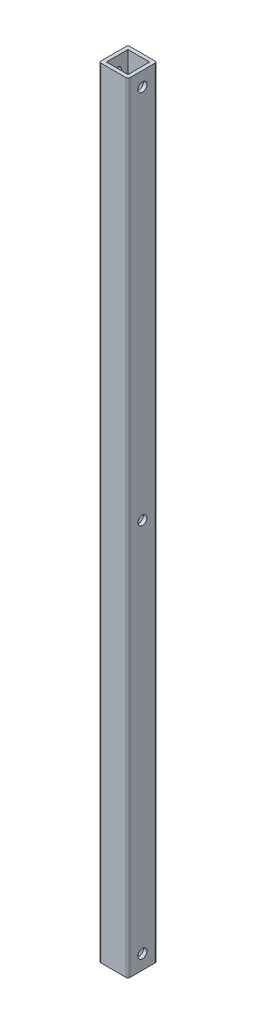
ISO-10303-21;
HEADER;
FILE_DESCRIPTION(('STEP AP214'),'2;1');
FILE_NAME('part.step','',(''),(''),'','','');
FILE_SCHEMA(('AUTOMOTIVE_DESIGN { 1 0 10303 214 1 1 1 1 }'));
ENDSEC;
DATA;
#1=APPLICATION_CONTEXT('core data for automotive mechanical design processes');
#2=APPLICATION_PROTOCOL_DEFINITION('international standard','automotive_design',2000,#1);
#3=PRODUCT_CONTEXT('',#1,'mechanical');
#4=PRODUCT('Part','Part','',(#3));
#5=PRODUCT_RELATED_PRODUCT_CATEGORY('part','',(#4));
#6=PRODUCT_DEFINITION_FORMATION('','',#4);
#7=PRODUCT_DEFINITION_CONTEXT('part definition',#1,'design');
#8=PRODUCT_DEFINITION('design','',#6,#7);
#9=PRODUCT_DEFINITION_SHAPE('','',#8);
#10=(LENGTH_UNIT() NAMED_UNIT(*) SI_UNIT(.MILLI.,.METRE.));
#11=(NAMED_UNIT(*) PLANE_ANGLE_UNIT() SI_UNIT($,.RADIAN.));
#12=(NAMED_UNIT(*) SI_UNIT($,.STERADIAN.) SOLID_ANGLE_UNIT());
#13=UNCERTAINTY_MEASURE_WITH_UNIT(LENGTH_MEASURE(1.E-05),#10,'distance_accuracy_value','');
#14=(GEOMETRIC_REPRESENTATION_CONTEXT(3) GLOBAL_UNCERTAINTY_ASSIGNED_CONTEXT((#13)) GLOBAL_UNIT_ASSIGNED_CONTEXT((#10,
#11,#12)) REPRESENTATION_CONTEXT('',''));
#15=CARTESIAN_POINT('',(0.,0.,0.));
#16=DIRECTION('',(0.,0.,1.));
#17=DIRECTION('',(1.,0.,0.));
#18=AXIS2_PLACEMENT_3D('',#15,#16,#17);
#19=CARTESIAN_POINT('',(0.,432.,0.));
#20=DIRECTION('',(0.,1.,0.));
#21=DIRECTION('',(0.,0.,1.));
#22=AXIS2_PLACEMENT_3D('',#19,#20,#21);
#23=PLANE('',#22);
#24=DIRECTION('',(-1.,0.,0.));
#25=VECTOR('',#24,1.);
#26=CARTESIAN_POINT('',(-5.51612903225806,432.,-5.7741935483871));
#27=LINE('',#26,#25);
#28=CARTESIAN_POINT('',(9.48387096774194,432.,-5.7741935483871));
#29=VERTEX_POINT('',#28);
#30=CARTESIAN_POINT('',(-4.51612903225806,432.,-5.7741935483871));
#31=VERTEX_POINT('',#30);
#32=EDGE_CURVE('E208',#29,#31,#27,.T.);
#33=ORIENTED_EDGE('',*,*,#32,.T.);
#34=CARTESIAN_POINT('',(-4.51612903225806,432.,-4.7741935483871));
#35=DIRECTION('',(0.,1.,0.));
#36=DIRECTION('',(0.,0.,1.));
#37=AXIS2_PLACEMENT_3D('',#34,#35,#36);
#38=CIRCLE('',#37,1.);
#39=CARTESIAN_POINT('',(-5.51612903225806,432.,-4.7741935483871));
#40=VERTEX_POINT('',#39);
#41=EDGE_CURVE('E259',#31,#40,#38,.T.);
#42=ORIENTED_EDGE('',*,*,#41,.T.);
#43=DIRECTION('',(0.,0.,1.));
#44=VECTOR('',#43,1.);
#45=CARTESIAN_POINT('',(-5.51612903225806,432.,-5.7741935483871));
#46=LINE('',#45,#44);
#47=CARTESIAN_POINT('',(-5.51612903225806,432.,9.2258064516129));
#48=VERTEX_POINT('',#47);
#49=EDGE_CURVE('E197',#40,#48,#46,.T.);
#50=ORIENTED_EDGE('',*,*,#49,.T.);
#51=CARTESIAN_POINT('',(-4.51612903225806,432.,9.2258064516129));
#52=DIRECTION('',(0.,1.,0.));
#53=DIRECTION('',(0.,0.,1.));
#54=AXIS2_PLACEMENT_3D('',#51,#52,#53);
#55=CIRCLE('',#54,1.);
#56=CARTESIAN_POINT('',(-4.51612903225806,432.,10.2258064516129));
#57=VERTEX_POINT('',#56);
#58=EDGE_CURVE('E256',#48,#57,#55,.T.);
#59=ORIENTED_EDGE('',*,*,#58,.T.);
#60=DIRECTION('',(1.,0.,0.));
#61=VECTOR('',#60,1.);
#62=CARTESIAN_POINT('',(-5.51612903225806,432.,10.2258064516129));
#63=LINE('',#62,#61);
#64=CARTESIAN_POINT('',(9.48387096774194,432.,10.2258064516129));
#65=VERTEX_POINT('',#64);
#66=EDGE_CURVE('E201',#57,#65,#63,.T.);
#67=ORIENTED_EDGE('',*,*,#66,.T.);
#68=CARTESIAN_POINT('',(9.48387096774194,432.,9.2258064516129));
#69=DIRECTION('',(0.,1.,0.));
#70=DIRECTION('',(0.,0.,1.));
#71=AXIS2_PLACEMENT_3D('',#68,#69,#70);
#72=CIRCLE('',#71,1.);
#73=CARTESIAN_POINT('',(10.4838709677419,432.,9.2258064516129));
#74=VERTEX_POINT('',#73);
#75=EDGE_CURVE('E72',#65,#74,#72,.T.);
#76=ORIENTED_EDGE('',*,*,#75,.T.);
#77=DIRECTION('',(0.,0.,-1.));
#78=VECTOR('',#77,1.);
#79=CARTESIAN_POINT('',(10.4838709677419,432.,-5.7741935483871));
#80=LINE('',#79,#78);
#81=CARTESIAN_POINT('',(10.4838709677419,432.,-4.7741935483871));
#82=VERTEX_POINT('',#81);
#83=EDGE_CURVE('E205',#74,#82,#80,.T.);
#84=ORIENTED_EDGE('',*,*,#83,.T.);
#85=CARTESIAN_POINT('',(9.48387096774194,432.,-4.7741935483871));
#86=DIRECTION('',(0.,1.,0.));
#87=DIRECTION('',(0.,0.,1.));
#88=AXIS2_PLACEMENT_3D('',#85,#86,#87);
#89=CIRCLE('',#88,1.);
#90=EDGE_CURVE('E253',#82,#29,#89,.T.);
#91=ORIENTED_EDGE('',*,*,#90,.T.);
#92=EDGE_LOOP('',(#33,#42,#50,#59,#67,#76,#84,#91));
#93=FACE_BOUND('',#92,.T.);
#94=DIRECTION('',(0.,0.,1.));
#95=VECTOR('',#94,1.);
#96=CARTESIAN_POINT('',(-3.51612903225806,432.,-3.7741935483871));
#97=LINE('',#96,#95);
#98=CARTESIAN_POINT('',(-3.51612903225806,432.,-3.7741935483871));
#99=VERTEX_POINT('',#98);
#100=CARTESIAN_POINT('',(-3.51612903225806,432.,8.2258064516129));
#101=VERTEX_POINT('',#100);
#102=EDGE_CURVE('E153',#99,#101,#97,.T.);
#103=ORIENTED_EDGE('',*,*,#102,.F.);
#104=DIRECTION('',(-1.,0.,0.));
#105=VECTOR('',#104,1.);
#106=CARTESIAN_POINT('',(-3.51612903225806,432.,-3.7741935483871));
#107=LINE('',#106,#105);
#108=CARTESIAN_POINT('',(8.48387096774194,432.,-3.7741935483871));
#109=VERTEX_POINT('',#108);
#110=EDGE_CURVE('E142',#109,#99,#107,.T.);
#111=ORIENTED_EDGE('',*,*,#110,.F.);
#112=DIRECTION('',(0.,0.,-1.));
#113=VECTOR('',#112,1.);
#114=CARTESIAN_POINT('',(8.48387096774194,432.,-3.7741935483871));
#115=LINE('',#114,#113);
#116=CARTESIAN_POINT('',(8.48387096774194,432.,8.2258064516129));
#117=VERTEX_POINT('',#116);
#118=EDGE_CURVE('E171',#117,#109,#115,.T.);
#119=ORIENTED_EDGE('',*,*,#118,.F.);
#120=DIRECTION('',(1.,0.,0.));
#121=VECTOR('',#120,1.);
#122=CARTESIAN_POINT('',(-3.51612903225806,432.,8.2258064516129));
#123=LINE('',#122,#121);
#124=EDGE_CURVE('E167',#101,#117,#123,.T.);
#125=ORIENTED_EDGE('',*,*,#124,.F.);
#126=EDGE_LOOP('',(#103,#111,#119,#125));
#127=FACE_BOUND('',#126,.T.);
#128=ADVANCED_FACE('F49',(#93,#127),#23,.T.);
#129=CARTESIAN_POINT('',(0.,0.,0.));
#130=DIRECTION('',(0.,1.,0.));
#131=DIRECTION('',(0.,0.,1.));
#132=AXIS2_PLACEMENT_3D('',#129,#130,#131);
#133=PLANE('',#132);
#134=DIRECTION('',(0.,0.,1.));
#135=VECTOR('',#134,1.);
#136=CARTESIAN_POINT('',(-5.51612903225806,0.,-5.7741935483871));
#137=LINE('',#136,#135);
#138=CARTESIAN_POINT('',(-5.51612903225806,0.,-4.7741935483871));
#139=VERTEX_POINT('',#138);
#140=CARTESIAN_POINT('',(-5.51612903225806,0.,9.2258064516129));
#141=VERTEX_POINT('',#140);
#142=EDGE_CURVE('E162',#139,#141,#137,.T.);
#143=ORIENTED_EDGE('',*,*,#142,.F.);
#144=CARTESIAN_POINT('',(-4.51612903225806,0.,-4.7741935483871));
#145=DIRECTION('',(0.,1.,0.));
#146=DIRECTION('',(0.,0.,1.));
#147=AXIS2_PLACEMENT_3D('',#144,#145,#146);
#148=CIRCLE('',#147,1.);
#149=CARTESIAN_POINT('',(-4.51612903225806,0.,-5.7741935483871));
#150=VERTEX_POINT('',#149);
#151=EDGE_CURVE('E241',#139,#150,#148,.F.);
#152=ORIENTED_EDGE('',*,*,#151,.T.);
#153=DIRECTION('',(-1.,0.,0.));
#154=VECTOR('',#153,1.);
#155=CARTESIAN_POINT('',(-5.51612903225806,0.,-5.7741935483871));
#156=LINE('',#155,#154);
#157=CARTESIAN_POINT('',(9.48387096774194,0.,-5.7741935483871));
#158=VERTEX_POINT('',#157);
#159=EDGE_CURVE('E202',#158,#150,#156,.T.);
#160=ORIENTED_EDGE('',*,*,#159,.F.);
#161=CARTESIAN_POINT('',(9.48387096774194,0.,-4.7741935483871));
#162=DIRECTION('',(0.,1.,0.));
#163=DIRECTION('',(0.,0.,1.));
#164=AXIS2_PLACEMENT_3D('',#161,#162,#163);
#165=CIRCLE('',#164,1.);
#166=CARTESIAN_POINT('',(10.4838709677419,0.,-4.7741935483871));
#167=VERTEX_POINT('',#166);
#168=EDGE_CURVE('E235',#158,#167,#165,.F.);
#169=ORIENTED_EDGE('',*,*,#168,.T.);
#170=DIRECTION('',(0.,0.,-1.));
#171=VECTOR('',#170,1.);
#172=CARTESIAN_POINT('',(10.4838709677419,0.,-5.7741935483871));
#173=LINE('',#172,#171);
#174=CARTESIAN_POINT('',(10.4838709677419,0.,9.2258064516129));
#175=VERTEX_POINT('',#174);
#176=EDGE_CURVE('E220',#175,#167,#173,.T.);
#177=ORIENTED_EDGE('',*,*,#176,.F.);
#178=CARTESIAN_POINT('',(9.48387096774194,0.,9.2258064516129));
#179=DIRECTION('',(0.,1.,0.));
#180=DIRECTION('',(0.,0.,1.));
#181=AXIS2_PLACEMENT_3D('',#178,#179,#180);
#182=CIRCLE('',#181,1.);
#183=CARTESIAN_POINT('',(9.48387096774194,0.,10.2258064516129));
#184=VERTEX_POINT('',#183);
#185=EDGE_CURVE('E232',#175,#184,#182,.F.);
#186=ORIENTED_EDGE('',*,*,#185,.T.);
#187=DIRECTION('',(1.,0.,0.));
#188=VECTOR('',#187,1.);
#189=CARTESIAN_POINT('',(-5.51612903225806,0.,10.2258064516129));
#190=LINE('',#189,#188);
#191=CARTESIAN_POINT('',(-4.51612903225806,0.,10.2258064516129));
#192=VERTEX_POINT('',#191);
#193=EDGE_CURVE('E216',#192,#184,#190,.T.);
#194=ORIENTED_EDGE('',*,*,#193,.F.);
#195=CARTESIAN_POINT('',(-4.51612903225806,0.,9.2258064516129));
#196=DIRECTION('',(0.,1.,0.));
#197=DIRECTION('',(0.,0.,1.));
#198=AXIS2_PLACEMENT_3D('',#195,#196,#197);
#199=CIRCLE('',#198,1.);
#200=EDGE_CURVE('E238',#192,#141,#199,.F.);
#201=ORIENTED_EDGE('',*,*,#200,.T.);
#202=EDGE_LOOP('',(#143,#152,#160,#169,#177,#186,#194,#201));
#203=FACE_BOUND('',#202,.T.);
#204=DIRECTION('',(-1.,0.,0.));
#205=VECTOR('',#204,1.);
#206=CARTESIAN_POINT('',(-3.51612903225806,0.,-3.7741935483871));
#207=LINE('',#206,#205);
#208=CARTESIAN_POINT('',(8.48387096774194,0.,-3.7741935483871));
#209=VERTEX_POINT('',#208);
#210=CARTESIAN_POINT('',(-3.51612903225806,0.,-3.7741935483871));
#211=VERTEX_POINT('',#210);
#212=EDGE_CURVE('E177',#209,#211,#207,.T.);
#213=ORIENTED_EDGE('',*,*,#212,.T.);
#214=DIRECTION('',(0.,0.,1.));
#215=VECTOR('',#214,1.);
#216=CARTESIAN_POINT('',(-3.51612903225806,0.,-3.7741935483871));
#217=LINE('',#216,#215);
#218=CARTESIAN_POINT('',(-3.51612903225806,0.,8.2258064516129));
#219=VERTEX_POINT('',#218);
#220=EDGE_CURVE('E160',#211,#219,#217,.T.);
#221=ORIENTED_EDGE('',*,*,#220,.T.);
#222=DIRECTION('',(1.,0.,0.));
#223=VECTOR('',#222,1.);
#224=CARTESIAN_POINT('',(-3.51612903225806,0.,8.2258064516129));
#225=LINE('',#224,#223);
#226=CARTESIAN_POINT('',(8.48387096774194,0.,8.2258064516129));
#227=VERTEX_POINT('',#226);
#228=EDGE_CURVE('E183',#219,#227,#225,.T.);
#229=ORIENTED_EDGE('',*,*,#228,.T.);
#230=DIRECTION('',(0.,0.,-1.));
#231=VECTOR('',#230,1.);
#232=CARTESIAN_POINT('',(8.48387096774194,0.,-3.7741935483871));
#233=LINE('',#232,#231);
#234=EDGE_CURVE('E154',#227,#209,#233,.T.);
#235=ORIENTED_EDGE('',*,*,#234,.T.);
#236=EDGE_LOOP('',(#213,#221,#229,#235));
#237=FACE_BOUND('',#236,.T.);
#238=ADVANCED_FACE('F337',(#203,#237),#133,.F.);
#239=CARTESIAN_POINT('',(-5.51612903225806,432.,-5.7741935483871));
#240=DIRECTION('',(1.,0.,0.));
#241=DIRECTION('',(0.,0.,-1.));
#242=AXIS2_PLACEMENT_3D('',#239,#240,#241);
#243=PLANE('',#242);
#244=CARTESIAN_POINT('',(-5.51612903225806,216.,2.2258064516129));
#245=DIRECTION('',(-1.,0.,0.));
#246=DIRECTION('',(0.,0.,1.));
#247=AXIS2_PLACEMENT_3D('',#244,#245,#246);
#248=CIRCLE('',#247,2.5);
#249=CARTESIAN_POINT('',(-5.51612903225806,216.,4.7258064516129));
#250=VERTEX_POINT('',#249);
#251=EDGE_CURVE('E309',#250,#250,#248,.T.);
#252=ORIENTED_EDGE('',*,*,#251,.F.);
#253=EDGE_LOOP('',(#252));
#254=FACE_BOUND('',#253,.T.);
#255=CARTESIAN_POINT('',(-5.51612903225806,424.,2.2258064516129));
#256=DIRECTION('',(-1.,0.,0.));
#257=DIRECTION('',(0.,0.,1.));
#258=AXIS2_PLACEMENT_3D('',#255,#256,#257);
#259=CIRCLE('',#258,2.5);
#260=CARTESIAN_POINT('',(-5.51612903225806,424.,4.7258064516129));
#261=VERTEX_POINT('',#260);
#262=EDGE_CURVE('E299',#261,#261,#259,.T.);
#263=ORIENTED_EDGE('',*,*,#262,.F.);
#264=EDGE_LOOP('',(#263));
#265=FACE_BOUND('',#264,.T.);
#266=CARTESIAN_POINT('',(-5.51612903225806,8.,2.2258064516129));
#267=DIRECTION('',(-1.,0.,0.));
#268=DIRECTION('',(0.,0.,1.));
#269=AXIS2_PLACEMENT_3D('',#266,#267,#268);
#270=CIRCLE('',#269,2.5);
#271=CARTESIAN_POINT('',(-5.51612903225806,8.,4.7258064516129));
#272=VERTEX_POINT('',#271);
#273=EDGE_CURVE('E294',#272,#272,#270,.T.);
#274=ORIENTED_EDGE('',*,*,#273,.F.);
#275=EDGE_LOOP('',(#274));
#276=FACE_BOUND('',#275,.T.);
#277=ORIENTED_EDGE('',*,*,#49,.F.);
#278=DIRECTION('',(0.,-1.,0.));
#279=VECTOR('',#278,1.);
#280=CARTESIAN_POINT('',(-5.51612903225806,432.,-4.7741935483871));
#281=LINE('',#280,#279);
#282=EDGE_CURVE('E228',#40,#139,#281,.T.);
#283=ORIENTED_EDGE('',*,*,#282,.T.);
#284=ORIENTED_EDGE('',*,*,#142,.T.);
#285=DIRECTION('',(0.,-1.,0.));
#286=VECTOR('',#285,1.);
#287=CARTESIAN_POINT('',(-5.51612903225806,432.,9.2258064516129));
#288=LINE('',#287,#286);
#289=EDGE_CURVE('E212',#141,#48,#288,.F.);
#290=ORIENTED_EDGE('',*,*,#289,.T.);
#291=EDGE_LOOP('',(#277,#283,#284,#290));
#292=FACE_BOUND('',#291,.T.);
#293=ADVANCED_FACE('F351',(#254,#265,#276,#292),#243,.F.);
#294=CARTESIAN_POINT('',(-5.51612903225806,432.,10.2258064516129));
#295=DIRECTION('',(0.,0.,-1.));
#296=DIRECTION('',(-1.,0.,0.));
#297=AXIS2_PLACEMENT_3D('',#294,#295,#296);
#298=PLANE('',#297);
#299=ORIENTED_EDGE('',*,*,#66,.F.);
#300=DIRECTION('',(0.,-1.,0.));
#301=VECTOR('',#300,1.);
#302=CARTESIAN_POINT('',(-4.51612903225806,432.,10.2258064516129));
#303=LINE('',#302,#301);
#304=EDGE_CURVE('E265',#57,#192,#303,.T.);
#305=ORIENTED_EDGE('',*,*,#304,.T.);
#306=ORIENTED_EDGE('',*,*,#193,.T.);
#307=DIRECTION('',(0.,-1.,0.));
#308=VECTOR('',#307,1.);
#309=CARTESIAN_POINT('',(9.48387096774194,432.,10.2258064516129));
#310=LINE('',#309,#308);
#311=EDGE_CURVE('E262',#184,#65,#310,.F.);
#312=ORIENTED_EDGE('',*,*,#311,.T.);
#313=EDGE_LOOP('',(#299,#305,#306,#312));
#314=FACE_BOUND('',#313,.T.);
#315=ADVANCED_FACE('F363',(#314),#298,.F.);
#316=CARTESIAN_POINT('',(10.4838709677419,432.,-5.7741935483871));
#317=DIRECTION('',(-1.,0.,0.));
#318=DIRECTION('',(0.,0.,1.));
#319=AXIS2_PLACEMENT_3D('',#316,#317,#318);
#320=PLANE('',#319);
#321=CARTESIAN_POINT('',(10.4838709677419,216.,2.2258064516129));
#322=DIRECTION('',(-1.,0.,0.));
#323=DIRECTION('',(0.,0.,1.));
#324=AXIS2_PLACEMENT_3D('',#321,#322,#323);
#325=CIRCLE('',#324,2.5);
#326=CARTESIAN_POINT('',(10.4838709677419,216.,4.7258064516129));
#327=VERTEX_POINT('',#326);
#328=EDGE_CURVE('E313',#327,#327,#325,.T.);
#329=ORIENTED_EDGE('',*,*,#328,.T.);
#330=EDGE_LOOP('',(#329));
#331=FACE_BOUND('',#330,.T.);
#332=CARTESIAN_POINT('',(10.4838709677419,424.,2.2258064516129));
#333=DIRECTION('',(-1.,0.,0.));
#334=DIRECTION('',(0.,0.,1.));
#335=AXIS2_PLACEMENT_3D('',#332,#333,#334);
#336=CIRCLE('',#335,2.5);
#337=CARTESIAN_POINT('',(10.4838709677419,424.,4.7258064516129));
#338=VERTEX_POINT('',#337);
#339=EDGE_CURVE('E276',#338,#338,#336,.T.);
#340=ORIENTED_EDGE('',*,*,#339,.T.);
#341=EDGE_LOOP('',(#340));
#342=FACE_BOUND('',#341,.T.);
#343=CARTESIAN_POINT('',(10.4838709677419,8.,2.2258064516129));
#344=DIRECTION('',(-1.,0.,0.));
#345=DIRECTION('',(0.,0.,1.));
#346=AXIS2_PLACEMENT_3D('',#343,#344,#345);
#347=CIRCLE('',#346,2.5);
#348=CARTESIAN_POINT('',(10.4838709677419,8.,4.7258064516129));
#349=VERTEX_POINT('',#348);
#350=EDGE_CURVE('E290',#349,#349,#347,.T.);
#351=ORIENTED_EDGE('',*,*,#350,.T.);
#352=EDGE_LOOP('',(#351));
#353=FACE_BOUND('',#352,.T.);
#354=ORIENTED_EDGE('',*,*,#176,.T.);
#355=DIRECTION('',(0.,-1.,0.));
#356=VECTOR('',#355,1.);
#357=CARTESIAN_POINT('',(10.4838709677419,432.,-4.7741935483871));
#358=LINE('',#357,#356);
#359=EDGE_CURVE('E11',#167,#82,#358,.F.);
#360=ORIENTED_EDGE('',*,*,#359,.T.);
#361=ORIENTED_EDGE('',*,*,#83,.F.);
#362=DIRECTION('',(0.,-1.,0.));
#363=VECTOR('',#362,1.);
#364=CARTESIAN_POINT('',(10.4838709677419,432.,9.2258064516129));
#365=LINE('',#364,#363);
#366=EDGE_CURVE('E59',#74,#175,#365,.T.);
#367=ORIENTED_EDGE('',*,*,#366,.T.);
#368=EDGE_LOOP('',(#354,#360,#361,#367));
#369=FACE_BOUND('',#368,.T.);
#370=ADVANCED_FACE('F359',(#331,#342,#353,#369),#320,.F.);
#371=CARTESIAN_POINT('',(-5.51612903225806,432.,-5.7741935483871));
#372=DIRECTION('',(0.,0.,1.));
#373=DIRECTION('',(1.,0.,0.));
#374=AXIS2_PLACEMENT_3D('',#371,#372,#373);
#375=PLANE('',#374);
#376=ORIENTED_EDGE('',*,*,#159,.T.);
#377=DIRECTION('',(0.,-1.,0.));
#378=VECTOR('',#377,1.);
#379=CARTESIAN_POINT('',(-4.51612903225806,432.,-5.7741935483871));
#380=LINE('',#379,#378);
#381=EDGE_CURVE('E248',#150,#31,#380,.F.);
#382=ORIENTED_EDGE('',*,*,#381,.T.);
#383=ORIENTED_EDGE('',*,*,#32,.F.);
#384=DIRECTION('',(0.,-1.,0.));
#385=VECTOR('',#384,1.);
#386=CARTESIAN_POINT('',(9.48387096774194,432.,-5.7741935483871));
#387=LINE('',#386,#385);
#388=EDGE_CURVE('E244',#29,#158,#387,.T.);
#389=ORIENTED_EDGE('',*,*,#388,.T.);
#390=EDGE_LOOP('',(#376,#382,#383,#389));
#391=FACE_BOUND('',#390,.T.);
#392=ADVANCED_FACE('F356',(#391),#375,.F.);
#393=CARTESIAN_POINT('',(-3.51612903225806,432.,-3.7741935483871));
#394=DIRECTION('',(0.,0.,1.));
#395=DIRECTION('',(1.,0.,0.));
#396=AXIS2_PLACEMENT_3D('',#393,#394,#395);
#397=PLANE('',#396);
#398=ORIENTED_EDGE('',*,*,#212,.F.);
#399=DIRECTION('',(0.,-1.,0.));
#400=VECTOR('',#399,1.);
#401=CARTESIAN_POINT('',(8.48387096774194,432.,-3.7741935483871));
#402=LINE('',#401,#400);
#403=EDGE_CURVE('E148',#109,#209,#402,.T.);
#404=ORIENTED_EDGE('',*,*,#403,.F.);
#405=ORIENTED_EDGE('',*,*,#110,.T.);
#406=DIRECTION('',(0.,-1.,0.));
#407=VECTOR('',#406,1.);
#408=CARTESIAN_POINT('',(-3.51612903225806,432.,-3.7741935483871));
#409=LINE('',#408,#407);
#410=EDGE_CURVE('E145',#99,#211,#409,.T.);
#411=ORIENTED_EDGE('',*,*,#410,.T.);
#412=EDGE_LOOP('',(#398,#404,#405,#411));
#413=FACE_BOUND('',#412,.T.);
#414=ADVANCED_FACE('F144',(#413),#397,.T.);
#415=CARTESIAN_POINT('',(-3.51612903225806,432.,-3.7741935483871));
#416=DIRECTION('',(1.,0.,0.));
#417=DIRECTION('',(0.,0.,-1.));
#418=AXIS2_PLACEMENT_3D('',#415,#416,#417);
#419=PLANE('',#418);
#420=CARTESIAN_POINT('',(-3.51612903225806,216.,2.2258064516129));
#421=DIRECTION('',(1.,0.,0.));
#422=DIRECTION('',(0.,0.,-1.));
#423=AXIS2_PLACEMENT_3D('',#420,#421,#422);
#424=CIRCLE('',#423,2.5);
#425=CARTESIAN_POINT('',(-3.51612903225806,216.,-0.2741935483871));
#426=VERTEX_POINT('',#425);
#427=EDGE_CURVE('E295',#426,#426,#424,.T.);
#428=ORIENTED_EDGE('',*,*,#427,.F.);
#429=EDGE_LOOP('',(#428));
#430=FACE_BOUND('',#429,.T.);
#431=CARTESIAN_POINT('',(-3.51612903225806,424.,2.2258064516129));
#432=DIRECTION('',(1.,0.,0.));
#433=DIRECTION('',(0.,0.,-1.));
#434=AXIS2_PLACEMENT_3D('',#431,#432,#433);
#435=CIRCLE('',#434,2.5);
#436=CARTESIAN_POINT('',(-3.51612903225806,424.,-0.274193548387098));
#437=VERTEX_POINT('',#436);
#438=EDGE_CURVE('E180',#437,#437,#435,.T.);
#439=ORIENTED_EDGE('',*,*,#438,.F.);
#440=EDGE_LOOP('',(#439));
#441=FACE_BOUND('',#440,.T.);
#442=CARTESIAN_POINT('',(-3.51612903225806,8.,2.2258064516129));
#443=DIRECTION('',(1.,0.,0.));
#444=DIRECTION('',(0.,0.,-1.));
#445=AXIS2_PLACEMENT_3D('',#442,#443,#444);
#446=CIRCLE('',#445,2.5);
#447=CARTESIAN_POINT('',(-3.51612903225806,8.,-0.2741935483871));
#448=VERTEX_POINT('',#447);
#449=EDGE_CURVE('E275',#448,#448,#446,.T.);
#450=ORIENTED_EDGE('',*,*,#449,.F.);
#451=EDGE_LOOP('',(#450));
#452=FACE_BOUND('',#451,.T.);
#453=ORIENTED_EDGE('',*,*,#220,.F.);
#454=ORIENTED_EDGE('',*,*,#410,.F.);
#455=ORIENTED_EDGE('',*,*,#102,.T.);
#456=DIRECTION('',(0.,-1.,0.));
#457=VECTOR('',#456,1.);
#458=CARTESIAN_POINT('',(-3.51612903225806,432.,8.2258064516129));
#459=LINE('',#458,#457);
#460=EDGE_CURVE('E163',#101,#219,#459,.T.);
#461=ORIENTED_EDGE('',*,*,#460,.T.);
#462=EDGE_LOOP('',(#453,#454,#455,#461));
#463=FACE_BOUND('',#462,.T.);
#464=ADVANCED_FACE('F157',(#430,#441,#452,#463),#419,.T.);
#465=CARTESIAN_POINT('',(-3.51612903225806,432.,8.2258064516129));
#466=DIRECTION('',(0.,0.,-1.));
#467=DIRECTION('',(-1.,0.,0.));
#468=AXIS2_PLACEMENT_3D('',#465,#466,#467);
#469=PLANE('',#468);
#470=ORIENTED_EDGE('',*,*,#228,.F.);
#471=ORIENTED_EDGE('',*,*,#460,.F.);
#472=ORIENTED_EDGE('',*,*,#124,.T.);
#473=DIRECTION('',(0.,-1.,0.));
#474=VECTOR('',#473,1.);
#475=CARTESIAN_POINT('',(8.48387096774194,432.,8.2258064516129));
#476=LINE('',#475,#474);
#477=EDGE_CURVE('E192',#117,#227,#476,.T.);
#478=ORIENTED_EDGE('',*,*,#477,.T.);
#479=EDGE_LOOP('',(#470,#471,#472,#478));
#480=FACE_BOUND('',#479,.T.);
#481=ADVANCED_FACE('F329',(#480),#469,.T.);
#482=CARTESIAN_POINT('',(8.48387096774194,432.,-3.7741935483871));
#483=DIRECTION('',(-1.,0.,0.));
#484=DIRECTION('',(0.,0.,1.));
#485=AXIS2_PLACEMENT_3D('',#482,#483,#484);
#486=PLANE('',#485);
#487=CARTESIAN_POINT('',(8.48387096774194,216.,2.2258064516129));
#488=DIRECTION('',(-1.,0.,0.));
#489=DIRECTION('',(0.,0.,1.));
#490=AXIS2_PLACEMENT_3D('',#487,#488,#489);
#491=CIRCLE('',#490,2.5);
#492=CARTESIAN_POINT('',(8.48387096774194,216.,4.7258064516129));
#493=VERTEX_POINT('',#492);
#494=EDGE_CURVE('E53',#493,#493,#491,.T.);
#495=ORIENTED_EDGE('',*,*,#494,.F.);
#496=EDGE_LOOP('',(#495));
#497=FACE_BOUND('',#496,.T.);
#498=CARTESIAN_POINT('',(8.48387096774194,424.,2.2258064516129));
#499=DIRECTION('',(-1.,0.,0.));
#500=DIRECTION('',(0.,0.,1.));
#501=AXIS2_PLACEMENT_3D('',#498,#499,#500);
#502=CIRCLE('',#501,2.5);
#503=CARTESIAN_POINT('',(8.48387096774194,424.,4.7258064516129));
#504=VERTEX_POINT('',#503);
#505=EDGE_CURVE('E277',#504,#504,#502,.T.);
#506=ORIENTED_EDGE('',*,*,#505,.F.);
#507=EDGE_LOOP('',(#506));
#508=FACE_BOUND('',#507,.T.);
#509=CARTESIAN_POINT('',(8.48387096774194,8.,2.2258064516129));
#510=DIRECTION('',(-1.,0.,0.));
#511=DIRECTION('',(0.,0.,1.));
#512=AXIS2_PLACEMENT_3D('',#509,#510,#511);
#513=CIRCLE('',#512,2.5);
#514=CARTESIAN_POINT('',(8.48387096774194,8.,4.7258064516129));
#515=VERTEX_POINT('',#514);
#516=EDGE_CURVE('E272',#515,#515,#513,.T.);
#517=ORIENTED_EDGE('',*,*,#516,.F.);
#518=EDGE_LOOP('',(#517));
#519=FACE_BOUND('',#518,.T.);
#520=ORIENTED_EDGE('',*,*,#234,.F.);
#521=ORIENTED_EDGE('',*,*,#477,.F.);
#522=ORIENTED_EDGE('',*,*,#118,.T.);
#523=ORIENTED_EDGE('',*,*,#403,.T.);
#524=EDGE_LOOP('',(#520,#521,#522,#523));
#525=FACE_BOUND('',#524,.T.);
#526=ADVANCED_FACE('F325',(#497,#508,#519,#525),#486,.T.);
#527=CARTESIAN_POINT('',(-4.51612903225806,432.,-4.7741935483871));
#528=DIRECTION('',(0.,-1.,0.));
#529=DIRECTION('',(0.,0.,-1.));
#530=AXIS2_PLACEMENT_3D('',#527,#528,#529);
#531=CYLINDRICAL_SURFACE('',#530,1.);
#532=ORIENTED_EDGE('',*,*,#41,.F.);
#533=ORIENTED_EDGE('',*,*,#381,.F.);
#534=ORIENTED_EDGE('',*,*,#151,.F.);
#535=ORIENTED_EDGE('',*,*,#282,.F.);
#536=EDGE_LOOP('',(#532,#533,#534,#535));
#537=FACE_BOUND('',#536,.T.);
#538=ADVANCED_FACE('F328',(#537),#531,.T.);
#539=CARTESIAN_POINT('',(-4.51612903225806,432.,9.2258064516129));
#540=DIRECTION('',(0.,-1.,0.));
#541=DIRECTION('',(0.,0.,-1.));
#542=AXIS2_PLACEMENT_3D('',#539,#540,#541);
#543=CYLINDRICAL_SURFACE('',#542,1.);
#544=ORIENTED_EDGE('',*,*,#58,.F.);
#545=ORIENTED_EDGE('',*,*,#289,.F.);
#546=ORIENTED_EDGE('',*,*,#200,.F.);
#547=ORIENTED_EDGE('',*,*,#304,.F.);
#548=EDGE_LOOP('',(#544,#545,#546,#547));
#549=FACE_BOUND('',#548,.T.);
#550=ADVANCED_FACE('F372',(#549),#543,.T.);
#551=CARTESIAN_POINT('',(9.48387096774194,432.,-4.7741935483871));
#552=DIRECTION('',(0.,-1.,0.));
#553=DIRECTION('',(0.,0.,-1.));
#554=AXIS2_PLACEMENT_3D('',#551,#552,#553);
#555=CYLINDRICAL_SURFACE('',#554,1.);
#556=ORIENTED_EDGE('',*,*,#90,.F.);
#557=ORIENTED_EDGE('',*,*,#359,.F.);
#558=ORIENTED_EDGE('',*,*,#168,.F.);
#559=ORIENTED_EDGE('',*,*,#388,.F.);
#560=EDGE_LOOP('',(#556,#557,#558,#559));
#561=FACE_BOUND('',#560,.T.);
#562=ADVANCED_FACE('F375',(#561),#555,.T.);
#563=CARTESIAN_POINT('',(9.48387096774194,432.,9.2258064516129));
#564=DIRECTION('',(0.,-1.,0.));
#565=DIRECTION('',(0.,0.,-1.));
#566=AXIS2_PLACEMENT_3D('',#563,#564,#565);
#567=CYLINDRICAL_SURFACE('',#566,1.);
#568=ORIENTED_EDGE('',*,*,#75,.F.);
#569=ORIENTED_EDGE('',*,*,#311,.F.);
#570=ORIENTED_EDGE('',*,*,#185,.F.);
#571=ORIENTED_EDGE('',*,*,#366,.F.);
#572=EDGE_LOOP('',(#568,#569,#570,#571));
#573=FACE_BOUND('',#572,.T.);
#574=ADVANCED_FACE('F51',(#573),#567,.T.);
#575=CARTESIAN_POINT('',(10.4838709677419,8.,2.2258064516129));
#576=DIRECTION('',(-1.,0.,0.));
#577=DIRECTION('',(0.,0.,1.));
#578=AXIS2_PLACEMENT_3D('',#575,#576,#577);
#579=CYLINDRICAL_SURFACE('',#578,2.5);
#580=ORIENTED_EDGE('',*,*,#516,.T.);
#581=EDGE_LOOP('',(#580));
#582=FACE_BOUND('',#581,.T.);
#583=ORIENTED_EDGE('',*,*,#350,.F.);
#584=EDGE_LOOP('',(#583));
#585=FACE_BOUND('',#584,.T.);
#586=ADVANCED_FACE('F382',(#582,#585),#579,.F.);
#587=CARTESIAN_POINT('',(10.4838709677419,424.,2.2258064516129));
#588=DIRECTION('',(-1.,0.,0.));
#589=DIRECTION('',(0.,0.,1.));
#590=AXIS2_PLACEMENT_3D('',#587,#588,#589);
#591=CYLINDRICAL_SURFACE('',#590,2.5);
#592=ORIENTED_EDGE('',*,*,#505,.T.);
#593=EDGE_LOOP('',(#592));
#594=FACE_BOUND('',#593,.T.);
#595=ORIENTED_EDGE('',*,*,#339,.F.);
#596=EDGE_LOOP('',(#595));
#597=FACE_BOUND('',#596,.T.);
#598=ADVANCED_FACE('F406',(#594,#597),#591,.F.);
#599=ORIENTED_EDGE('',*,*,#449,.T.);
#600=EDGE_LOOP('',(#599));
#601=FACE_BOUND('',#600,.T.);
#602=ORIENTED_EDGE('',*,*,#273,.T.);
#603=EDGE_LOOP('',(#602));
#604=FACE_BOUND('',#603,.T.);
#605=ADVANCED_FACE('F409',(#601,#604),#579,.F.);
#606=ORIENTED_EDGE('',*,*,#438,.T.);
#607=EDGE_LOOP('',(#606));
#608=FACE_BOUND('',#607,.T.);
#609=ORIENTED_EDGE('',*,*,#262,.T.);
#610=EDGE_LOOP('',(#609));
#611=FACE_BOUND('',#610,.T.);
#612=ADVANCED_FACE('F415',(#608,#611),#591,.F.);
#613=CARTESIAN_POINT('',(10.4838709677419,216.,2.2258064516129));
#614=DIRECTION('',(-1.,0.,0.));
#615=DIRECTION('',(0.,0.,1.));
#616=AXIS2_PLACEMENT_3D('',#613,#614,#615);
#617=CYLINDRICAL_SURFACE('',#616,2.5);
#618=ORIENTED_EDGE('',*,*,#494,.T.);
#619=EDGE_LOOP('',(#618));
#620=FACE_BOUND('',#619,.T.);
#621=ORIENTED_EDGE('',*,*,#328,.F.);
#622=EDGE_LOOP('',(#621));
#623=FACE_BOUND('',#622,.T.);
#624=ADVANCED_FACE('F322',(#620,#623),#617,.F.);
#625=ORIENTED_EDGE('',*,*,#427,.T.);
#626=EDGE_LOOP('',(#625));
#627=FACE_BOUND('',#626,.T.);
#628=ORIENTED_EDGE('',*,*,#251,.T.);
#629=EDGE_LOOP('',(#628));
#630=FACE_BOUND('',#629,.T.);
#631=ADVANCED_FACE('F428',(#627,#630),#617,.F.);
#632=CLOSED_SHELL('',(#128,#238,#293,#315,#370,#392,#414,#464,#481,#526,#538,#550,#562,#574,
#586,#598,#605,#612,#624,#631));
#633=MANIFOLD_SOLID_BREP('B2',#632);
#634=ADVANCED_BREP_SHAPE_REPRESENTATION('',(#18,#633),#14);
#635=SHAPE_DEFINITION_REPRESENTATION(#9,#634);
ENDSEC;
END-ISO-10303-21;
